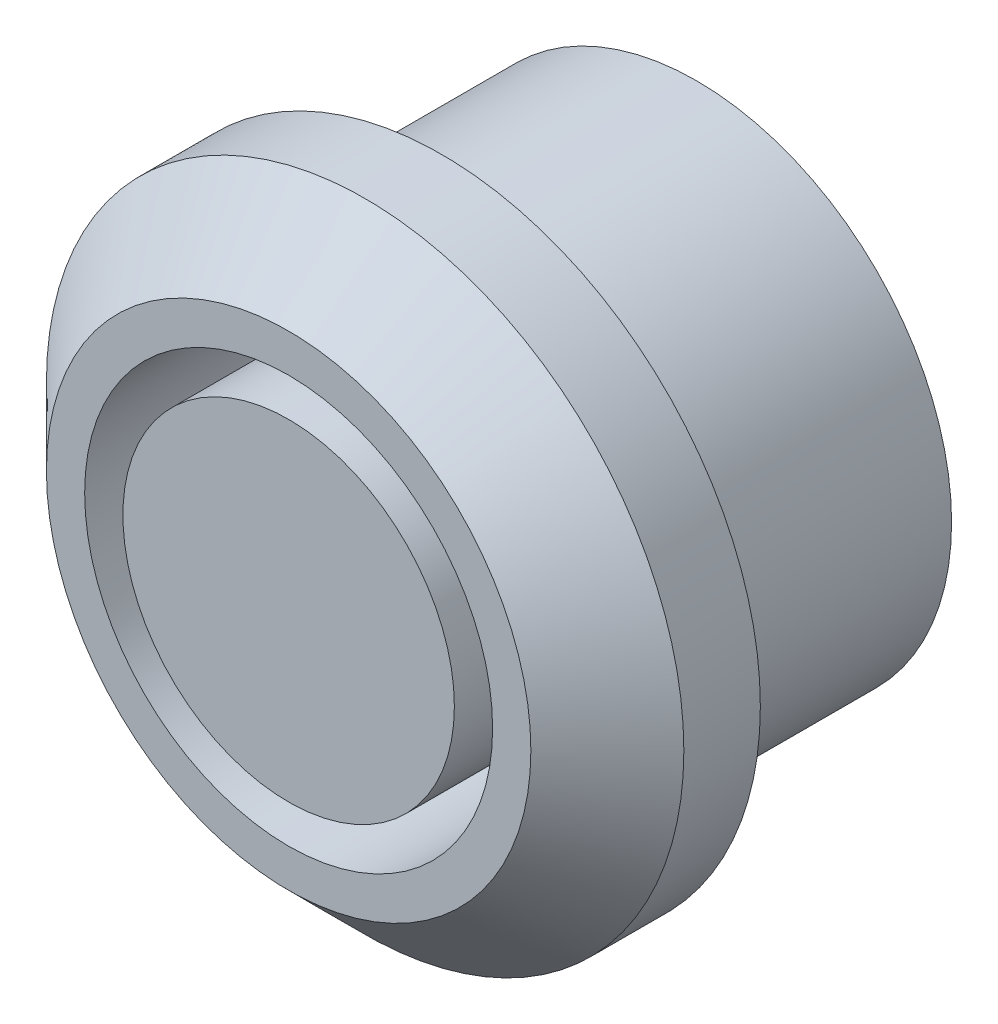
ISO-10303-21;
HEADER;
FILE_DESCRIPTION(('STEP AP214'),'2;1');
FILE_NAME('part.step','',(''),(''),'','','');
FILE_SCHEMA(('AUTOMOTIVE_DESIGN { 1 0 10303 214 1 1 1 1 }'));
ENDSEC;
DATA;
#1=APPLICATION_CONTEXT('core data for automotive mechanical design processes');
#2=APPLICATION_PROTOCOL_DEFINITION('international standard','automotive_design',2000,#1);
#3=PRODUCT_CONTEXT('',#1,'mechanical');
#4=PRODUCT('Part','Part','',(#3));
#5=PRODUCT_RELATED_PRODUCT_CATEGORY('part','',(#4));
#6=PRODUCT_DEFINITION_FORMATION('','',#4);
#7=PRODUCT_DEFINITION_CONTEXT('part definition',#1,'design');
#8=PRODUCT_DEFINITION('design','',#6,#7);
#9=PRODUCT_DEFINITION_SHAPE('','',#8);
#10=(LENGTH_UNIT() NAMED_UNIT(*) SI_UNIT(.MILLI.,.METRE.));
#11=(NAMED_UNIT(*) PLANE_ANGLE_UNIT() SI_UNIT($,.RADIAN.));
#12=(NAMED_UNIT(*) SI_UNIT($,.STERADIAN.) SOLID_ANGLE_UNIT());
#13=UNCERTAINTY_MEASURE_WITH_UNIT(LENGTH_MEASURE(1.E-05),#10,'distance_accuracy_value','');
#14=(GEOMETRIC_REPRESENTATION_CONTEXT(3) GLOBAL_UNCERTAINTY_ASSIGNED_CONTEXT((#13)) GLOBAL_UNIT_ASSIGNED_CONTEXT((#10,
#11,#12)) REPRESENTATION_CONTEXT('',''));
#15=CARTESIAN_POINT('',(0.,0.,0.));
#16=DIRECTION('',(0.,0.,1.));
#17=DIRECTION('',(1.,0.,0.));
#18=AXIS2_PLACEMENT_3D('',#15,#16,#17);
#19=CARTESIAN_POINT('',(0.,0.,-4.));
#20=DIRECTION('',(0.,0.,1.));
#21=DIRECTION('',(1.,0.,0.));
#22=AXIS2_PLACEMENT_3D('',#19,#20,#21);
#23=PLANE('',#22);
#24=CARTESIAN_POINT('',(0.,0.,-4.));
#25=DIRECTION('',(0.,0.,1.));
#26=DIRECTION('',(1.,0.,0.));
#27=AXIS2_PLACEMENT_3D('',#24,#25,#26);
#28=CIRCLE('',#27,8.);
#29=CARTESIAN_POINT('',(8.,0.,-4.));
#30=VERTEX_POINT('',#29);
#31=EDGE_CURVE('E54',#30,#30,#28,.T.);
#32=ORIENTED_EDGE('',*,*,#31,.T.);
#33=EDGE_LOOP('',(#32));
#34=FACE_BOUND('',#33,.T.);
#35=CARTESIAN_POINT('',(0.,0.,-4.));
#36=DIRECTION('',(0.,0.,1.));
#37=DIRECTION('',(1.,0.,0.));
#38=AXIS2_PLACEMENT_3D('',#35,#36,#37);
#39=CIRCLE('',#38,6.5);
#40=CARTESIAN_POINT('',(6.5,0.,-4.));
#41=VERTEX_POINT('',#40);
#42=EDGE_CURVE('E63',#41,#41,#39,.T.);
#43=ORIENTED_EDGE('',*,*,#42,.F.);
#44=EDGE_LOOP('',(#43));
#45=FACE_BOUND('',#44,.T.);
#46=ADVANCED_FACE('F31',(#34,#45),#23,.T.);
#47=CARTESIAN_POINT('',(0.,0.,0.));
#48=DIRECTION('',(0.,0.,1.));
#49=DIRECTION('',(1.,0.,0.));
#50=AXIS2_PLACEMENT_3D('',#47,#48,#49);
#51=PLANE('',#50);
#52=CARTESIAN_POINT('',(0.,0.,0.));
#53=DIRECTION('',(0.,0.,1.));
#54=DIRECTION('',(1.,0.,0.));
#55=AXIS2_PLACEMENT_3D('',#52,#53,#54);
#56=CIRCLE('',#55,12.5);
#57=CARTESIAN_POINT('',(12.5,0.,0.));
#58=VERTEX_POINT('',#57);
#59=EDGE_CURVE('E46',#58,#58,#56,.T.);
#60=ORIENTED_EDGE('',*,*,#59,.F.);
#61=EDGE_LOOP('',(#60));
#62=FACE_BOUND('',#61,.T.);
#63=CARTESIAN_POINT('',(0.,0.,0.));
#64=DIRECTION('',(0.,0.,1.));
#65=DIRECTION('',(1.,0.,0.));
#66=AXIS2_PLACEMENT_3D('',#63,#64,#65);
#67=CIRCLE('',#66,10.);
#68=CARTESIAN_POINT('',(10.,0.,0.));
#69=VERTEX_POINT('',#68);
#70=EDGE_CURVE('E10',#69,#69,#67,.F.);
#71=ORIENTED_EDGE('',*,*,#70,.F.);
#72=EDGE_LOOP('',(#71));
#73=FACE_BOUND('',#72,.T.);
#74=ADVANCED_FACE('F70',(#62,#73),#51,.F.);
#75=CARTESIAN_POINT('',(0.,0.,6.));
#76=DIRECTION('',(0.,0.,-1.));
#77=DIRECTION('',(-1.,0.,0.));
#78=AXIS2_PLACEMENT_3D('',#75,#76,#77);
#79=CYLINDRICAL_SURFACE('',#78,12.5);
#80=CARTESIAN_POINT('',(0.,0.,2.99999999999998));
#81=DIRECTION('',(0.,0.,1.));
#82=DIRECTION('',(1.,0.,0.));
#83=AXIS2_PLACEMENT_3D('',#80,#81,#82);
#84=CIRCLE('',#83,12.5);
#85=CARTESIAN_POINT('',(12.5,0.,2.99999999999998));
#86=VERTEX_POINT('',#85);
#87=EDGE_CURVE('E38',#86,#86,#84,.F.);
#88=ORIENTED_EDGE('',*,*,#87,.T.);
#89=EDGE_LOOP('',(#88));
#90=FACE_BOUND('',#89,.T.);
#91=ORIENTED_EDGE('',*,*,#59,.T.);
#92=EDGE_LOOP('',(#91));
#93=FACE_BOUND('',#92,.T.);
#94=ADVANCED_FACE('F33',(#90,#93),#79,.T.);
#95=CARTESIAN_POINT('',(0.,0.,6.));
#96=DIRECTION('',(0.,0.,1.));
#97=DIRECTION('',(1.,0.,0.));
#98=AXIS2_PLACEMENT_3D('',#95,#96,#97);
#99=PLANE('',#98);
#100=CARTESIAN_POINT('',(0.,0.,6.));
#101=DIRECTION('',(0.,0.,1.));
#102=DIRECTION('',(1.,0.,0.));
#103=AXIS2_PLACEMENT_3D('',#100,#101,#102);
#104=CIRCLE('',#103,8.);
#105=CARTESIAN_POINT('',(8.,0.,6.));
#106=VERTEX_POINT('',#105);
#107=EDGE_CURVE('E57',#106,#106,#104,.T.);
#108=ORIENTED_EDGE('',*,*,#107,.F.);
#109=EDGE_LOOP('',(#108));
#110=FACE_BOUND('',#109,.T.);
#111=CARTESIAN_POINT('',(0.,0.,6.));
#112=DIRECTION('',(0.,0.,1.));
#113=DIRECTION('',(1.,0.,0.));
#114=AXIS2_PLACEMENT_3D('',#111,#112,#113);
#115=CIRCLE('',#114,9.49999999999995);
#116=CARTESIAN_POINT('',(9.49999999999995,0.,6.));
#117=VERTEX_POINT('',#116);
#118=EDGE_CURVE('E42',#117,#117,#115,.T.);
#119=ORIENTED_EDGE('',*,*,#118,.T.);
#120=EDGE_LOOP('',(#119));
#121=FACE_BOUND('',#120,.T.);
#122=ADVANCED_FACE('F95',(#110,#121),#99,.T.);
#123=CARTESIAN_POINT('',(0.,0.,6.));
#124=DIRECTION('',(0.,0.,-1.));
#125=DIRECTION('',(-1.,0.,0.));
#126=AXIS2_PLACEMENT_3D('',#123,#124,#125);
#127=CONICAL_SURFACE('',#126,9.49999999999995,0.785398163397454);
#128=ORIENTED_EDGE('',*,*,#87,.F.);
#129=EDGE_LOOP('',(#128));
#130=FACE_BOUND('',#129,.T.);
#131=ORIENTED_EDGE('',*,*,#118,.F.);
#132=EDGE_LOOP('',(#131));
#133=FACE_BOUND('',#132,.T.);
#134=ADVANCED_FACE('F92',(#130,#133),#127,.T.);
#135=CARTESIAN_POINT('',(0.,0.,-10.));
#136=DIRECTION('',(0.,0.,1.));
#137=DIRECTION('',(1.,0.,0.));
#138=AXIS2_PLACEMENT_3D('',#135,#136,#137);
#139=CYLINDRICAL_SURFACE('',#138,10.);
#140=CARTESIAN_POINT('',(0.,0.,-10.));
#141=DIRECTION('',(0.,0.,-1.));
#142=DIRECTION('',(-1.,0.,0.));
#143=AXIS2_PLACEMENT_3D('',#140,#141,#142);
#144=CIRCLE('',#143,10.);
#145=CARTESIAN_POINT('',(-10.,0.,-10.));
#146=VERTEX_POINT('',#145);
#147=EDGE_CURVE('E51',#146,#146,#144,.T.);
#148=ORIENTED_EDGE('',*,*,#147,.F.);
#149=EDGE_LOOP('',(#148));
#150=FACE_BOUND('',#149,.T.);
#151=ORIENTED_EDGE('',*,*,#70,.T.);
#152=EDGE_LOOP('',(#151));
#153=FACE_BOUND('',#152,.T.);
#154=ADVANCED_FACE('F88',(#150,#153),#139,.T.);
#155=CARTESIAN_POINT('',(0.,0.,-10.));
#156=DIRECTION('',(0.,0.,-1.));
#157=DIRECTION('',(-1.,0.,0.));
#158=AXIS2_PLACEMENT_3D('',#155,#156,#157);
#159=PLANE('',#158);
#160=ORIENTED_EDGE('',*,*,#147,.T.);
#161=EDGE_LOOP('',(#160));
#162=FACE_BOUND('',#161,.T.);
#163=ADVANCED_FACE('F84',(#162),#159,.T.);
#164=CARTESIAN_POINT('',(0.,0.,-4.));
#165=DIRECTION('',(0.,0.,1.));
#166=DIRECTION('',(1.,0.,0.));
#167=AXIS2_PLACEMENT_3D('',#164,#165,#166);
#168=CYLINDRICAL_SURFACE('',#167,8.);
#169=ORIENTED_EDGE('',*,*,#31,.F.);
#170=EDGE_LOOP('',(#169));
#171=FACE_BOUND('',#170,.T.);
#172=ORIENTED_EDGE('',*,*,#107,.T.);
#173=EDGE_LOOP('',(#172));
#174=FACE_BOUND('',#173,.T.);
#175=ADVANCED_FACE('F81',(#171,#174),#168,.F.);
#176=CARTESIAN_POINT('',(0.,0.,6.));
#177=DIRECTION('',(0.,0.,-1.));
#178=DIRECTION('',(-1.,0.,0.));
#179=AXIS2_PLACEMENT_3D('',#176,#177,#178);
#180=CYLINDRICAL_SURFACE('',#179,6.5);
#181=CARTESIAN_POINT('',(0.,0.,6.));
#182=DIRECTION('',(0.,0.,1.));
#183=DIRECTION('',(1.,0.,0.));
#184=AXIS2_PLACEMENT_3D('',#181,#182,#183);
#185=CIRCLE('',#184,6.5);
#186=CARTESIAN_POINT('',(6.5,0.,6.));
#187=VERTEX_POINT('',#186);
#188=EDGE_CURVE('E60',#187,#187,#185,.T.);
#189=ORIENTED_EDGE('',*,*,#188,.F.);
#190=EDGE_LOOP('',(#189));
#191=FACE_BOUND('',#190,.T.);
#192=ORIENTED_EDGE('',*,*,#42,.T.);
#193=EDGE_LOOP('',(#192));
#194=FACE_BOUND('',#193,.T.);
#195=ADVANCED_FACE('F67',(#191,#194),#180,.T.);
#196=CARTESIAN_POINT('',(0.,0.,6.));
#197=DIRECTION('',(0.,0.,1.));
#198=DIRECTION('',(1.,0.,0.));
#199=AXIS2_PLACEMENT_3D('',#196,#197,#198);
#200=PLANE('',#199);
#201=ORIENTED_EDGE('',*,*,#188,.T.);
#202=EDGE_LOOP('',(#201));
#203=FACE_BOUND('',#202,.T.);
#204=ADVANCED_FACE('F136',(#203),#200,.T.);
#205=CLOSED_SHELL('',(#46,#74,#94,#122,#134,#154,#163,#175,#195,#204));
#206=MANIFOLD_SOLID_BREP('B2',#205);
#207=ADVANCED_BREP_SHAPE_REPRESENTATION('',(#18,#206),#14);
#208=SHAPE_DEFINITION_REPRESENTATION(#9,#207);
ENDSEC;
END-ISO-10303-21;
